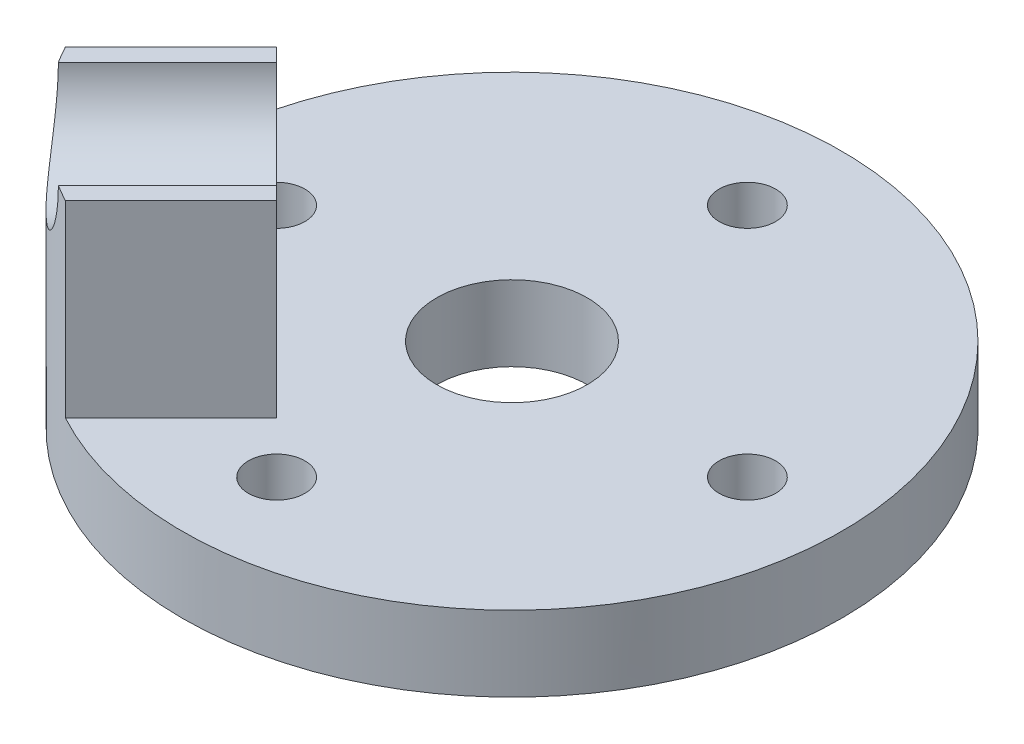
ISO-10303-21;
HEADER;
FILE_DESCRIPTION(('STEP AP214'),'2;1');
FILE_NAME('part.step','',(''),(''),'','','');
FILE_SCHEMA(('AUTOMOTIVE_DESIGN { 1 0 10303 214 1 1 1 1 }'));
ENDSEC;
DATA;
#1=APPLICATION_CONTEXT('core data for automotive mechanical design processes');
#2=APPLICATION_PROTOCOL_DEFINITION('international standard','automotive_design',2000,#1);
#3=PRODUCT_CONTEXT('',#1,'mechanical');
#4=PRODUCT('Part','Part','',(#3));
#5=PRODUCT_RELATED_PRODUCT_CATEGORY('part','',(#4));
#6=PRODUCT_DEFINITION_FORMATION('','',#4);
#7=PRODUCT_DEFINITION_CONTEXT('part definition',#1,'design');
#8=PRODUCT_DEFINITION('design','',#6,#7);
#9=PRODUCT_DEFINITION_SHAPE('','',#8);
#10=(LENGTH_UNIT() NAMED_UNIT(*) SI_UNIT(.MILLI.,.METRE.));
#11=(NAMED_UNIT(*) PLANE_ANGLE_UNIT() SI_UNIT($,.RADIAN.));
#12=(NAMED_UNIT(*) SI_UNIT($,.STERADIAN.) SOLID_ANGLE_UNIT());
#13=UNCERTAINTY_MEASURE_WITH_UNIT(LENGTH_MEASURE(1.E-05),#10,'distance_accuracy_value','');
#14=(GEOMETRIC_REPRESENTATION_CONTEXT(3) GLOBAL_UNCERTAINTY_ASSIGNED_CONTEXT((#13)) GLOBAL_UNIT_ASSIGNED_CONTEXT((#10,
#11,#12)) REPRESENTATION_CONTEXT('',''));
#15=CARTESIAN_POINT('',(0.,0.,0.));
#16=DIRECTION('',(0.,0.,1.));
#17=DIRECTION('',(1.,0.,0.));
#18=AXIS2_PLACEMENT_3D('',#15,#16,#17);
#19=CARTESIAN_POINT('',(0.,14.,0.));
#20=DIRECTION('',(0.,1.,0.));
#21=DIRECTION('',(0.,0.,1.));
#22=AXIS2_PLACEMENT_3D('',#19,#20,#21);
#23=PLANE('',#22);
#24=DIRECTION('',(0.707106781186548,0.,-0.707106781186547));
#25=VECTOR('',#24,1.);
#26=CARTESIAN_POINT('',(-10.4926406871193,14.,16.1494949366117));
#27=LINE('',#26,#25);
#28=CARTESIAN_POINT('',(-9.21835667841057,14.,14.8752109279029));
#29=VERTEX_POINT('',#28);
#30=CARTESIAN_POINT('',(-3.42157287525381,14.,9.07842712474619));
#31=VERTEX_POINT('',#30);
#32=EDGE_CURVE('E11',#29,#31,#27,.T.);
#33=ORIENTED_EDGE('',*,*,#32,.F.);
#34=CARTESIAN_POINT('',(0.,14.,0.));
#35=DIRECTION('',(0.,1.,0.));
#36=DIRECTION('',(0.,0.,1.));
#37=AXIS2_PLACEMENT_3D('',#34,#35,#36);
#38=CIRCLE('',#37,17.5);
#39=CARTESIAN_POINT('',(-8.32300731969869,14.,15.3940751315642));
#40=VERTEX_POINT('',#39);
#41=EDGE_CURVE('E109',#29,#40,#38,.T.);
#42=ORIENTED_EDGE('',*,*,#41,.T.);
#43=DIRECTION('',(-0.707106781186548,0.,0.707106781186548));
#44=VECTOR('',#43,1.);
#45=CARTESIAN_POINT('',(3.53553390593274,14.,3.53553390593274));
#46=LINE('',#45,#44);
#47=CARTESIAN_POINT('',(-2.71446609406726,14.,9.78553390593274));
#48=VERTEX_POINT('',#47);
#49=EDGE_CURVE('E101',#48,#40,#46,.T.);
#50=ORIENTED_EDGE('',*,*,#49,.F.);
#51=DIRECTION('',(0.707106781186548,0.,0.707106781186548));
#52=VECTOR('',#51,1.);
#53=CARTESIAN_POINT('',(-6.25,14.,6.25));
#54=LINE('',#53,#52);
#55=EDGE_CURVE('E95',#31,#48,#54,.T.);
#56=ORIENTED_EDGE('',*,*,#55,.F.);
#57=EDGE_LOOP('',(#33,#42,#50,#56));
#58=FACE_BOUND('',#57,.T.);
#59=ADVANCED_FACE('F35',(#58),#23,.T.);
#60=CARTESIAN_POINT('',(0.,4.,0.));
#61=DIRECTION('',(0.,1.,0.));
#62=DIRECTION('',(0.,0.,1.));
#63=AXIS2_PLACEMENT_3D('',#60,#61,#62);
#64=PLANE('',#63);
#65=CARTESIAN_POINT('',(0.,4.,12.5));
#66=DIRECTION('',(0.,1.,0.));
#67=DIRECTION('',(0.,0.,1.));
#68=AXIS2_PLACEMENT_3D('',#65,#66,#67);
#69=CIRCLE('',#68,1.5);
#70=CARTESIAN_POINT('',(0.,4.,14.));
#71=VERTEX_POINT('',#70);
#72=EDGE_CURVE('E128',#71,#71,#69,.T.);
#73=ORIENTED_EDGE('',*,*,#72,.F.);
#74=EDGE_LOOP('',(#73));
#75=FACE_BOUND('',#74,.T.);
#76=CARTESIAN_POINT('',(-12.5,4.,0.));
#77=DIRECTION('',(0.,1.,0.));
#78=DIRECTION('',(0.,0.,1.));
#79=AXIS2_PLACEMENT_3D('',#76,#77,#78);
#80=CIRCLE('',#79,1.5);
#81=CARTESIAN_POINT('',(-12.5,4.,1.5));
#82=VERTEX_POINT('',#81);
#83=EDGE_CURVE('E131',#82,#82,#80,.T.);
#84=ORIENTED_EDGE('',*,*,#83,.F.);
#85=EDGE_LOOP('',(#84));
#86=FACE_BOUND('',#85,.T.);
#87=CARTESIAN_POINT('',(0.,4.,-12.5));
#88=DIRECTION('',(0.,1.,0.));
#89=DIRECTION('',(0.,0.,1.));
#90=AXIS2_PLACEMENT_3D('',#87,#88,#89);
#91=CIRCLE('',#90,1.5);
#92=CARTESIAN_POINT('',(0.,4.,-11.));
#93=VERTEX_POINT('',#92);
#94=EDGE_CURVE('E135',#93,#93,#91,.T.);
#95=ORIENTED_EDGE('',*,*,#94,.F.);
#96=EDGE_LOOP('',(#95));
#97=FACE_BOUND('',#96,.T.);
#98=CARTESIAN_POINT('',(12.5,4.,0.));
#99=DIRECTION('',(0.,1.,0.));
#100=DIRECTION('',(0.,0.,1.));
#101=AXIS2_PLACEMENT_3D('',#98,#99,#100);
#102=CIRCLE('',#101,1.5);
#103=CARTESIAN_POINT('',(12.5,4.,1.5));
#104=VERTEX_POINT('',#103);
#105=EDGE_CURVE('E138',#104,#104,#102,.T.);
#106=ORIENTED_EDGE('',*,*,#105,.F.);
#107=EDGE_LOOP('',(#106));
#108=FACE_BOUND('',#107,.T.);
#109=CARTESIAN_POINT('',(0.,4.,0.));
#110=DIRECTION('',(0.,1.,0.));
#111=DIRECTION('',(0.,0.,1.));
#112=AXIS2_PLACEMENT_3D('',#109,#110,#111);
#113=CIRCLE('',#112,4.);
#114=CARTESIAN_POINT('',(0.,4.,4.));
#115=VERTEX_POINT('',#114);
#116=EDGE_CURVE('E144',#115,#115,#113,.T.);
#117=ORIENTED_EDGE('',*,*,#116,.F.);
#118=EDGE_LOOP('',(#117));
#119=FACE_BOUND('',#118,.T.);
#120=DIRECTION('',(0.707106781186548,0.,0.707106781186548));
#121=VECTOR('',#120,1.);
#122=CARTESIAN_POINT('',(-6.25,4.,6.25));
#123=LINE('',#122,#121);
#124=CARTESIAN_POINT('',(-9.78553390593274,4.,2.71446609406726));
#125=VERTEX_POINT('',#124);
#126=CARTESIAN_POINT('',(-2.71446609406726,4.,9.78553390593274));
#127=VERTEX_POINT('',#126);
#128=EDGE_CURVE('E115',#125,#127,#123,.T.);
#129=ORIENTED_EDGE('',*,*,#128,.T.);
#130=DIRECTION('',(-0.707106781186548,0.,0.707106781186548));
#131=VECTOR('',#130,1.);
#132=CARTESIAN_POINT('',(3.53553390593274,4.,3.53553390593274));
#133=LINE('',#132,#131);
#134=CARTESIAN_POINT('',(-8.32300731969869,4.,15.3940751315642));
#135=VERTEX_POINT('',#134);
#136=EDGE_CURVE('E57',#127,#135,#133,.T.);
#137=ORIENTED_EDGE('',*,*,#136,.T.);
#138=CARTESIAN_POINT('',(0.,4.,0.));
#139=DIRECTION('',(0.,1.,0.));
#140=DIRECTION('',(0.,0.,1.));
#141=AXIS2_PLACEMENT_3D('',#138,#139,#140);
#142=CIRCLE('',#141,17.5);
#143=CARTESIAN_POINT('',(-15.3940751315642,4.,8.32300731969868));
#144=VERTEX_POINT('',#143);
#145=EDGE_CURVE('E141',#135,#144,#142,.T.);
#146=ORIENTED_EDGE('',*,*,#145,.T.);
#147=DIRECTION('',(-0.707106781186548,0.,0.707106781186548));
#148=VECTOR('',#147,1.);
#149=CARTESIAN_POINT('',(-3.53553390593274,4.,-3.53553390593274));
#150=LINE('',#149,#148);
#151=EDGE_CURVE('E104',#125,#144,#150,.T.);
#152=ORIENTED_EDGE('',*,*,#151,.F.);
#153=EDGE_LOOP('',(#129,#137,#146,#152));
#154=FACE_BOUND('',#153,.T.);
#155=ADVANCED_FACE('F176',(#75,#86,#97,#108,#119,#154),#64,.T.);
#156=CARTESIAN_POINT('',(0.,4.,0.));
#157=DIRECTION('',(0.,-1.,0.));
#158=DIRECTION('',(0.,0.,-1.));
#159=AXIS2_PLACEMENT_3D('',#156,#157,#158);
#160=CYLINDRICAL_SURFACE('',#159,17.5);
#161=ORIENTED_EDGE('',*,*,#41,.F.);
#162=CARTESIAN_POINT('',(-9.21835667841057,14.,14.8752109279029));
#163=CARTESIAN_POINT('',(-9.2183399527107,13.8890681509802,14.8752118548658));
#164=CARTESIAN_POINT('',(-9.22238560268898,13.7781434770407,14.8727139142408));
#165=CARTESIAN_POINT('',(-9.23847459912364,13.5571174327618,14.8627302665708));
#166=CARTESIAN_POINT('',(-9.25051676370563,13.4470159431883,14.8552452966015));
#167=CARTESIAN_POINT('',(-9.28244355284723,13.2286052351257,14.8353151893756));
#168=CARTESIAN_POINT('',(-9.30231427282285,13.1202931917971,14.8228788460231));
#169=CARTESIAN_POINT('',(-9.34963475324,12.9060591164303,14.7930762717094));
#170=CARTESIAN_POINT('',(-9.37708458412046,12.8001371066145,14.7757099949303));
#171=CARTESIAN_POINT('',(-9.47035921883595,12.487064998065,14.7162431189568));
#172=CARTESIAN_POINT('',(-9.54713872198201,12.2844107142015,14.6667565930159));
#173=CARTESIAN_POINT('',(-9.7264163808457,11.8970188146421,14.5484804190136));
#174=CARTESIAN_POINT('',(-9.82891951395099,11.7122846760033,14.479687034871));
#175=CARTESIAN_POINT('',(-10.0573494514645,11.3624938790227,14.3219849696195));
#176=CARTESIAN_POINT('',(-10.1836335492499,11.1978105343623,14.2327642643098));
#177=CARTESIAN_POINT('',(-10.4535642747361,10.8961004838254,14.0356998956147));
#178=CARTESIAN_POINT('',(-10.5972136281362,10.759078128731,13.9278533075165));
#179=CARTESIAN_POINT('',(-10.8983291346355,10.5150796799612,13.6935450058628));
#180=CARTESIAN_POINT('',(-11.0559354485058,10.4084680773347,13.566883073985));
#181=CARTESIAN_POINT('',(-11.3778037966525,10.2306870822243,13.2981005202675));
#182=CARTESIAN_POINT('',(-11.5420646648157,10.1595115088972,13.1559825995737));
#183=CARTESIAN_POINT('',(-11.8687220564562,10.0558050140799,12.8619934931367));
#184=CARTESIAN_POINT('',(-12.0311026361792,10.0226360881499,12.7103298356111));
#185=CARTESIAN_POINT('',(-12.3515786072962,9.99388734164157,12.3991276532458));
#186=CARTESIAN_POINT('',(-12.5096744334348,9.99830369311109,12.2395899320022));
#187=CARTESIAN_POINT('',(-12.8141030696693,10.0441310500121,11.9204247356069));
#188=CARTESIAN_POINT('',(-12.9605998538317,10.0848532048815,11.7608539974999));
#189=CARTESIAN_POINT('',(-13.2414632559073,10.2010359651051,11.4437121221334));
#190=CARTESIAN_POINT('',(-13.3758293929992,10.2764979467159,11.2861410643476));
#191=CARTESIAN_POINT('',(-13.6307506429605,10.460610280488,10.9769368425272));
#192=CARTESIAN_POINT('',(-13.7511886369789,10.5695173599362,10.8253602240852));
#193=CARTESIAN_POINT('',(-13.9751506249324,10.8172430120138,10.5346517413876));
#194=CARTESIAN_POINT('',(-14.0786725777869,10.9560651895038,10.395521379806));
#195=CARTESIAN_POINT('',(-14.2697172835643,11.2633581348487,10.1317484691518));
#196=CARTESIAN_POINT('',(-14.3568258613845,11.4324277375761,10.0075041238469));
#197=CARTESIAN_POINT('',(-14.5113310888089,11.7936653030108,9.78212736198156));
#198=CARTESIAN_POINT('',(-14.5787223517071,11.9858395576395,9.68100126289717));
#199=CARTESIAN_POINT('',(-14.6646768902271,12.2876218411558,9.54986810958884));
#200=CARTESIAN_POINT('',(-14.6908536870883,12.3907503245014,9.50950647668263));
#201=CARTESIAN_POINT('',(-14.7380537689139,12.6007382001695,9.4361897613408));
#202=CARTESIAN_POINT('',(-14.7590790911724,12.7075960984281,9.40323175136639));
#203=CARTESIAN_POINT('',(-14.7959209809337,12.9241673914184,9.34515406548121));
#204=CARTESIAN_POINT('',(-14.8117429465925,13.0338776985967,9.32002626764592));
#205=CARTESIAN_POINT('',(-14.8381780340987,13.2554190271487,9.277881836259));
#206=CARTESIAN_POINT('',(-14.8487936123733,13.3672490225136,9.26086137769041));
#207=CARTESIAN_POINT('',(-14.8629401578894,13.5659970748536,9.23813553612393));
#208=CARTESIAN_POINT('',(-14.8675455333231,13.6526484373145,9.23071775952363));
#209=CARTESIAN_POINT('',(-14.8736783787543,13.8261972970282,9.22082960919045));
#210=CARTESIAN_POINT('',(-14.8752109274896,13.9130941500369,9.21835107197281));
#211=CARTESIAN_POINT('',(-14.875210927903,14.,9.21835667841057));
#212=B_SPLINE_CURVE_WITH_KNOTS('',3,(#162,#163,#164,#165,#166,#167,#168,#169,#170,#171,#172,
#173,#174,#175,#176,#177,#178,#179,#180,#181,#182,#183,#184,#185,#186,#187,#188,#189,#190,#191,
#192,#193,#194,#195,#196,#197,#198,#199,#200,#201,#202,#203,#204,#205,#206,#207,#208,#209,#210,
#211),.UNSPECIFIED.,.F.,.F.,(4,2,2,2,2,2,2,2,2,2,2,2,2,2,2,2,2,2,2,2,2,2,2,2,4),(0.,
0.332681247866697,0.665313336820846,0.997357270100383,1.32940428944207,1.99290262989594,
2.65652945292504,3.33106339250548,4.00570334664101,4.68811868485081,5.37041495269124,
6.0410817607265,6.71168026410031,7.36981967360707,8.02798515827641,8.69133469760162,
9.35476421731793,10.0331782060872,10.7117773626502,11.0528239514451,11.3937354453644,
11.7342921410368,12.0746880036043,12.3357711604052,12.5964224446493),.UNSPECIFIED.);
#213=CARTESIAN_POINT('',(-14.875210927903,14.,9.21835667841057));
#214=VERTEX_POINT('',#213);
#215=EDGE_CURVE('E88',#29,#214,#212,.T.);
#216=ORIENTED_EDGE('',*,*,#215,.T.);
#217=CARTESIAN_POINT('',(-15.3940751315642,14.,8.32300731969868));
#218=VERTEX_POINT('',#217);
#219=EDGE_CURVE('E110',#218,#214,#38,.T.);
#220=ORIENTED_EDGE('',*,*,#219,.F.);
#221=DIRECTION('',(0.,-1.,0.));
#222=VECTOR('',#221,1.);
#223=CARTESIAN_POINT('',(-15.3940751315642,14.,8.32300731969868));
#224=LINE('',#223,#222);
#225=EDGE_CURVE('E120',#218,#144,#224,.T.);
#226=ORIENTED_EDGE('',*,*,#225,.T.);
#227=ORIENTED_EDGE('',*,*,#145,.F.);
#228=DIRECTION('',(0.,-1.,0.));
#229=VECTOR('',#228,1.);
#230=CARTESIAN_POINT('',(-8.32300731969869,14.,15.3940751315642));
#231=LINE('',#230,#229);
#232=EDGE_CURVE('E113',#40,#135,#231,.T.);
#233=ORIENTED_EDGE('',*,*,#232,.F.);
#234=EDGE_LOOP('',(#161,#216,#220,#226,#227,#233));
#235=FACE_BOUND('',#234,.T.);
#236=CARTESIAN_POINT('',(0.,0.,0.));
#237=DIRECTION('',(0.,1.,0.));
#238=DIRECTION('',(0.,0.,1.));
#239=AXIS2_PLACEMENT_3D('',#236,#237,#238);
#240=CIRCLE('',#239,17.5);
#241=CARTESIAN_POINT('',(0.,0.,17.5));
#242=VERTEX_POINT('',#241);
#243=EDGE_CURVE('E158',#242,#242,#240,.T.);
#244=ORIENTED_EDGE('',*,*,#243,.T.);
#245=EDGE_LOOP('',(#244));
#246=FACE_BOUND('',#245,.T.);
#247=ADVANCED_FACE('F165',(#235,#246),#160,.T.);
#248=CARTESIAN_POINT('',(12.5,4.,0.));
#249=DIRECTION('',(0.,-1.,0.));
#250=DIRECTION('',(0.,0.,-1.));
#251=AXIS2_PLACEMENT_3D('',#248,#249,#250);
#252=CYLINDRICAL_SURFACE('',#251,1.5);
#253=ORIENTED_EDGE('',*,*,#105,.T.);
#254=EDGE_LOOP('',(#253));
#255=FACE_BOUND('',#254,.T.);
#256=CARTESIAN_POINT('',(12.5,0.,0.));
#257=DIRECTION('',(0.,1.,0.));
#258=DIRECTION('',(0.,0.,1.));
#259=AXIS2_PLACEMENT_3D('',#256,#257,#258);
#260=CIRCLE('',#259,1.5);
#261=CARTESIAN_POINT('',(12.5,0.,1.5));
#262=VERTEX_POINT('',#261);
#263=EDGE_CURVE('E155',#262,#262,#260,.T.);
#264=ORIENTED_EDGE('',*,*,#263,.F.);
#265=EDGE_LOOP('',(#264));
#266=FACE_BOUND('',#265,.T.);
#267=ADVANCED_FACE('F235',(#255,#266),#252,.F.);
#268=CARTESIAN_POINT('',(0.,4.,-12.5));
#269=DIRECTION('',(0.,-1.,0.));
#270=DIRECTION('',(0.,0.,-1.));
#271=AXIS2_PLACEMENT_3D('',#268,#269,#270);
#272=CYLINDRICAL_SURFACE('',#271,1.5);
#273=ORIENTED_EDGE('',*,*,#94,.T.);
#274=EDGE_LOOP('',(#273));
#275=FACE_BOUND('',#274,.T.);
#276=CARTESIAN_POINT('',(0.,0.,-12.5));
#277=DIRECTION('',(0.,1.,0.));
#278=DIRECTION('',(0.,0.,1.));
#279=AXIS2_PLACEMENT_3D('',#276,#277,#278);
#280=CIRCLE('',#279,1.5);
#281=CARTESIAN_POINT('',(0.,0.,-11.));
#282=VERTEX_POINT('',#281);
#283=EDGE_CURVE('E152',#282,#282,#280,.T.);
#284=ORIENTED_EDGE('',*,*,#283,.F.);
#285=EDGE_LOOP('',(#284));
#286=FACE_BOUND('',#285,.T.);
#287=ADVANCED_FACE('F249',(#275,#286),#272,.F.);
#288=CARTESIAN_POINT('',(-12.5,4.,0.));
#289=DIRECTION('',(0.,-1.,0.));
#290=DIRECTION('',(0.,0.,-1.));
#291=AXIS2_PLACEMENT_3D('',#288,#289,#290);
#292=CYLINDRICAL_SURFACE('',#291,1.5);
#293=ORIENTED_EDGE('',*,*,#83,.T.);
#294=EDGE_LOOP('',(#293));
#295=FACE_BOUND('',#294,.T.);
#296=CARTESIAN_POINT('',(-12.5,0.,0.));
#297=DIRECTION('',(0.,1.,0.));
#298=DIRECTION('',(0.,0.,1.));
#299=AXIS2_PLACEMENT_3D('',#296,#297,#298);
#300=CIRCLE('',#299,1.5);
#301=CARTESIAN_POINT('',(-12.5,0.,1.5));
#302=VERTEX_POINT('',#301);
#303=EDGE_CURVE('E149',#302,#302,#300,.T.);
#304=ORIENTED_EDGE('',*,*,#303,.F.);
#305=EDGE_LOOP('',(#304));
#306=FACE_BOUND('',#305,.T.);
#307=ADVANCED_FACE('F257',(#295,#306),#292,.F.);
#308=CARTESIAN_POINT('',(0.,4.,12.5));
#309=DIRECTION('',(0.,-1.,0.));
#310=DIRECTION('',(0.,0.,-1.));
#311=AXIS2_PLACEMENT_3D('',#308,#309,#310);
#312=CYLINDRICAL_SURFACE('',#311,1.5);
#313=ORIENTED_EDGE('',*,*,#72,.T.);
#314=EDGE_LOOP('',(#313));
#315=FACE_BOUND('',#314,.T.);
#316=CARTESIAN_POINT('',(0.,0.,12.5));
#317=DIRECTION('',(0.,1.,0.));
#318=DIRECTION('',(0.,0.,1.));
#319=AXIS2_PLACEMENT_3D('',#316,#317,#318);
#320=CIRCLE('',#319,1.5);
#321=CARTESIAN_POINT('',(0.,0.,14.));
#322=VERTEX_POINT('',#321);
#323=EDGE_CURVE('E127',#322,#322,#320,.T.);
#324=ORIENTED_EDGE('',*,*,#323,.F.);
#325=EDGE_LOOP('',(#324));
#326=FACE_BOUND('',#325,.T.);
#327=ADVANCED_FACE('F37',(#315,#326),#312,.F.);
#328=CARTESIAN_POINT('',(0.,4.,0.));
#329=DIRECTION('',(0.,-1.,0.));
#330=DIRECTION('',(0.,0.,-1.));
#331=AXIS2_PLACEMENT_3D('',#328,#329,#330);
#332=CYLINDRICAL_SURFACE('',#331,4.);
#333=ORIENTED_EDGE('',*,*,#116,.T.);
#334=EDGE_LOOP('',(#333));
#335=FACE_BOUND('',#334,.T.);
#336=CARTESIAN_POINT('',(0.,0.,0.));
#337=DIRECTION('',(0.,1.,0.));
#338=DIRECTION('',(0.,0.,1.));
#339=AXIS2_PLACEMENT_3D('',#336,#337,#338);
#340=CIRCLE('',#339,4.);
#341=CARTESIAN_POINT('',(0.,0.,4.));
#342=VERTEX_POINT('',#341);
#343=EDGE_CURVE('E132',#342,#342,#340,.T.);
#344=ORIENTED_EDGE('',*,*,#343,.F.);
#345=EDGE_LOOP('',(#344));
#346=FACE_BOUND('',#345,.T.);
#347=ADVANCED_FACE('F187',(#335,#346),#332,.F.);
#348=CARTESIAN_POINT('',(0.,0.,0.));
#349=DIRECTION('',(0.,1.,0.));
#350=DIRECTION('',(0.,0.,1.));
#351=AXIS2_PLACEMENT_3D('',#348,#349,#350);
#352=PLANE('',#351);
#353=ORIENTED_EDGE('',*,*,#323,.T.);
#354=EDGE_LOOP('',(#353));
#355=FACE_BOUND('',#354,.T.);
#356=ORIENTED_EDGE('',*,*,#303,.T.);
#357=EDGE_LOOP('',(#356));
#358=FACE_BOUND('',#357,.T.);
#359=ORIENTED_EDGE('',*,*,#283,.T.);
#360=EDGE_LOOP('',(#359));
#361=FACE_BOUND('',#360,.T.);
#362=ORIENTED_EDGE('',*,*,#263,.T.);
#363=EDGE_LOOP('',(#362));
#364=FACE_BOUND('',#363,.T.);
#365=ORIENTED_EDGE('',*,*,#243,.F.);
#366=EDGE_LOOP('',(#365));
#367=FACE_BOUND('',#366,.T.);
#368=ORIENTED_EDGE('',*,*,#343,.T.);
#369=EDGE_LOOP('',(#368));
#370=FACE_BOUND('',#369,.T.);
#371=ADVANCED_FACE('F180',(#355,#358,#361,#364,#367,#370),#352,.F.);
#372=CARTESIAN_POINT('',(3.53553390593274,14.,3.53553390593274));
#373=DIRECTION('',(0.707106781186548,0.,0.707106781186548));
#374=DIRECTION('',(0.707106781186548,0.,-0.707106781186548));
#375=AXIS2_PLACEMENT_3D('',#372,#373,#374);
#376=PLANE('',#375);
#377=ORIENTED_EDGE('',*,*,#136,.F.);
#378=DIRECTION('',(0.,-1.,0.));
#379=VECTOR('',#378,1.);
#380=CARTESIAN_POINT('',(-2.71446609406726,14.,9.78553390593274));
#381=LINE('',#380,#379);
#382=EDGE_CURVE('E125',#48,#127,#381,.T.);
#383=ORIENTED_EDGE('',*,*,#382,.F.);
#384=ORIENTED_EDGE('',*,*,#49,.T.);
#385=ORIENTED_EDGE('',*,*,#232,.T.);
#386=EDGE_LOOP('',(#377,#383,#384,#385));
#387=FACE_BOUND('',#386,.T.);
#388=ADVANCED_FACE('F178',(#387),#376,.T.);
#389=CARTESIAN_POINT('',(-6.25,14.,6.25));
#390=DIRECTION('',(0.707106781186548,0.,-0.707106781186548));
#391=DIRECTION('',(-0.707106781186548,0.,-0.707106781186548));
#392=AXIS2_PLACEMENT_3D('',#389,#390,#391);
#393=PLANE('',#392);
#394=CARTESIAN_POINT('',(-6.25,14.,6.25));
#395=DIRECTION('',(0.707106781186548,0.,-0.707106781186547));
#396=DIRECTION('',(-0.707106781186547,0.,-0.707106781186548));
#397=AXIS2_PLACEMENT_3D('',#394,#395,#396);
#398=CIRCLE('',#397,4.);
#399=CARTESIAN_POINT('',(-9.07842712474619,14.,3.42157287525381));
#400=VERTEX_POINT('',#399);
#401=EDGE_CURVE('E49',#31,#400,#398,.T.);
#402=ORIENTED_EDGE('',*,*,#401,.F.);
#403=ORIENTED_EDGE('',*,*,#55,.T.);
#404=ORIENTED_EDGE('',*,*,#382,.T.);
#405=ORIENTED_EDGE('',*,*,#128,.F.);
#406=DIRECTION('',(0.,-1.,0.));
#407=VECTOR('',#406,1.);
#408=CARTESIAN_POINT('',(-9.78553390593274,14.,2.71446609406726));
#409=LINE('',#408,#407);
#410=CARTESIAN_POINT('',(-9.78553390593274,14.,2.71446609406726));
#411=VERTEX_POINT('',#410);
#412=EDGE_CURVE('E123',#411,#125,#409,.T.);
#413=ORIENTED_EDGE('',*,*,#412,.F.);
#414=EDGE_CURVE('E97',#411,#400,#54,.T.);
#415=ORIENTED_EDGE('',*,*,#414,.T.);
#416=EDGE_LOOP('',(#402,#403,#404,#405,#413,#415));
#417=FACE_BOUND('',#416,.T.);
#418=ADVANCED_FACE('F94',(#417),#393,.T.);
#419=CARTESIAN_POINT('',(-3.53553390593274,14.,-3.53553390593274));
#420=DIRECTION('',(0.707106781186548,0.,0.707106781186548));
#421=DIRECTION('',(0.707106781186548,0.,-0.707106781186548));
#422=AXIS2_PLACEMENT_3D('',#419,#420,#421);
#423=PLANE('',#422);
#424=ORIENTED_EDGE('',*,*,#151,.T.);
#425=ORIENTED_EDGE('',*,*,#225,.F.);
#426=DIRECTION('',(-0.707106781186548,0.,0.707106781186548));
#427=VECTOR('',#426,1.);
#428=CARTESIAN_POINT('',(-3.53553390593274,14.,-3.53553390593274));
#429=LINE('',#428,#427);
#430=EDGE_CURVE('E103',#411,#218,#429,.T.);
#431=ORIENTED_EDGE('',*,*,#430,.F.);
#432=ORIENTED_EDGE('',*,*,#412,.T.);
#433=EDGE_LOOP('',(#424,#425,#431,#432));
#434=FACE_BOUND('',#433,.T.);
#435=ADVANCED_FACE('F172',(#434),#423,.F.);
#436=DIRECTION('',(0.707106781186548,0.,-0.707106781186547));
#437=VECTOR('',#436,1.);
#438=CARTESIAN_POINT('',(-16.1494949366117,14.,10.4926406871193));
#439=LINE('',#438,#437);
#440=EDGE_CURVE('E43',#400,#214,#439,.F.);
#441=ORIENTED_EDGE('',*,*,#440,.F.);
#442=ORIENTED_EDGE('',*,*,#414,.F.);
#443=ORIENTED_EDGE('',*,*,#430,.T.);
#444=ORIENTED_EDGE('',*,*,#219,.T.);
#445=EDGE_LOOP('',(#441,#442,#443,#444));
#446=FACE_BOUND('',#445,.T.);
#447=ADVANCED_FACE('F168',(#446),#23,.T.);
#448=CARTESIAN_POINT('',(-13.3210678118655,14.,13.3210678118655));
#449=DIRECTION('',(0.707106781186548,0.,-0.707106781186547));
#450=DIRECTION('',(-0.707106781186547,0.,-0.707106781186548));
#451=AXIS2_PLACEMENT_3D('',#448,#449,#450);
#452=CYLINDRICAL_SURFACE('',#451,4.);
#453=ORIENTED_EDGE('',*,*,#32,.T.);
#454=ORIENTED_EDGE('',*,*,#401,.T.);
#455=ORIENTED_EDGE('',*,*,#440,.T.);
#456=ORIENTED_EDGE('',*,*,#215,.F.);
#457=EDGE_LOOP('',(#453,#454,#455,#456));
#458=FACE_BOUND('',#457,.T.);
#459=ADVANCED_FACE('F86',(#458),#452,.F.);
#460=CLOSED_SHELL('',(#59,#155,#247,#267,#287,#307,#327,#347,#371,#388,#418,#435,#447,#459));
#461=MANIFOLD_SOLID_BREP('B2',#460);
#462=ADVANCED_BREP_SHAPE_REPRESENTATION('',(#18,#461),#14);
#463=SHAPE_DEFINITION_REPRESENTATION(#9,#462);
ENDSEC;
END-ISO-10303-21;
